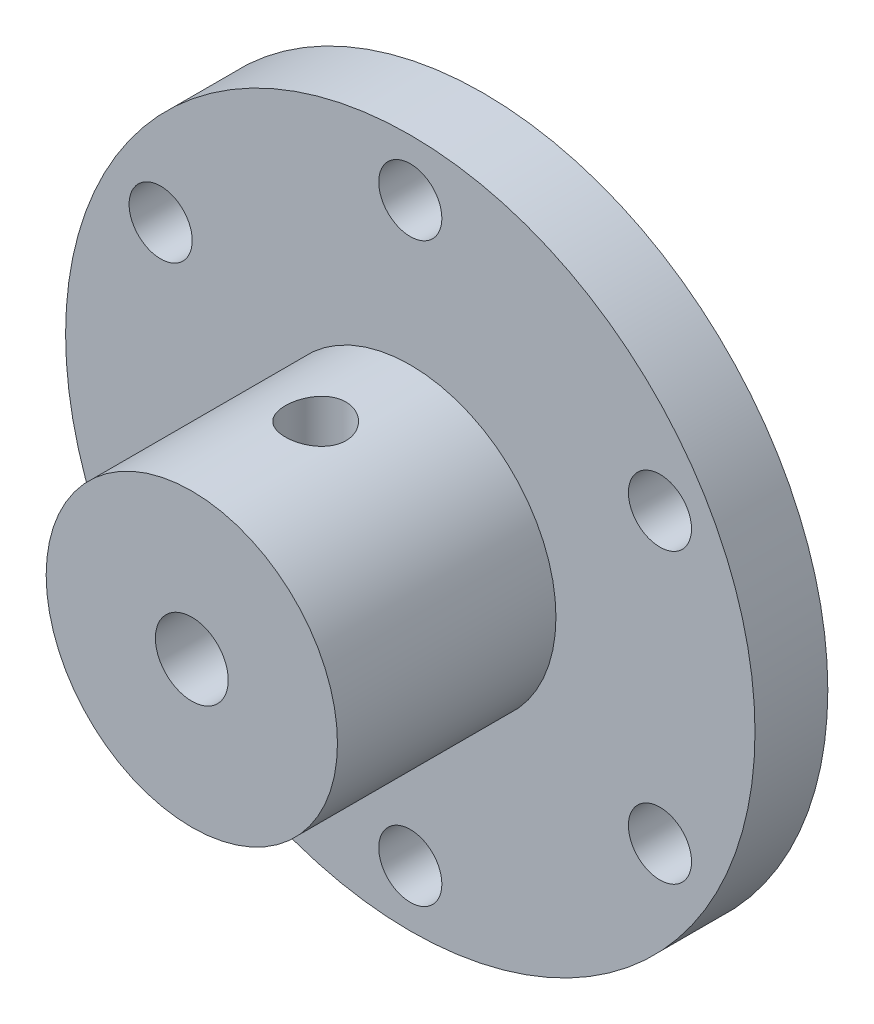
ISO-10303-21;
HEADER;
FILE_DESCRIPTION(('STEP AP214'),'2;1');
FILE_NAME('part.step','',(''),(''),'','','');
FILE_SCHEMA(('AUTOMOTIVE_DESIGN { 1 0 10303 214 1 1 1 1 }'));
ENDSEC;
DATA;
#1=APPLICATION_CONTEXT('core data for automotive mechanical design processes');
#2=APPLICATION_PROTOCOL_DEFINITION('international standard','automotive_design',2000,#1);
#3=PRODUCT_CONTEXT('',#1,'mechanical');
#4=PRODUCT('Part','Part','',(#3));
#5=PRODUCT_RELATED_PRODUCT_CATEGORY('part','',(#4));
#6=PRODUCT_DEFINITION_FORMATION('','',#4);
#7=PRODUCT_DEFINITION_CONTEXT('part definition',#1,'design');
#8=PRODUCT_DEFINITION('design','',#6,#7);
#9=PRODUCT_DEFINITION_SHAPE('','',#8);
#10=(LENGTH_UNIT() NAMED_UNIT(*) SI_UNIT(.MILLI.,.METRE.));
#11=(NAMED_UNIT(*) PLANE_ANGLE_UNIT() SI_UNIT($,.RADIAN.));
#12=(NAMED_UNIT(*) SI_UNIT($,.STERADIAN.) SOLID_ANGLE_UNIT());
#13=UNCERTAINTY_MEASURE_WITH_UNIT(LENGTH_MEASURE(1.E-05),#10,'distance_accuracy_value','');
#14=(GEOMETRIC_REPRESENTATION_CONTEXT(3) GLOBAL_UNCERTAINTY_ASSIGNED_CONTEXT((#13)) GLOBAL_UNIT_ASSIGNED_CONTEXT((#10,
#11,#12)) REPRESENTATION_CONTEXT('',''));
#15=CARTESIAN_POINT('',(0.,0.,0.));
#16=DIRECTION('',(0.,0.,1.));
#17=DIRECTION('',(1.,0.,0.));
#18=AXIS2_PLACEMENT_3D('',#15,#16,#17);
#19=CARTESIAN_POINT('',(0.,0.,24.));
#20=DIRECTION('',(0.,0.,-1.));
#21=DIRECTION('',(-1.,0.,0.));
#22=AXIS2_PLACEMENT_3D('',#19,#20,#21);
#23=CYLINDRICAL_SURFACE('',#22,12.);
#24=CARTESIAN_POINT('',(0.,0.,24.));
#25=DIRECTION('',(0.,0.,-1.));
#26=DIRECTION('',(-1.,0.,0.));
#27=AXIS2_PLACEMENT_3D('',#24,#25,#26);
#28=CIRCLE('',#27,12.);
#29=CARTESIAN_POINT('',(-12.,0.,24.));
#30=VERTEX_POINT('',#29);
#31=EDGE_CURVE('E54',#30,#30,#28,.T.);
#32=ORIENTED_EDGE('',*,*,#31,.T.);
#33=EDGE_LOOP('',(#32));
#34=FACE_BOUND('',#33,.T.);
#35=CARTESIAN_POINT('',(0.,0.,6.));
#36=DIRECTION('',(0.,0.,1.));
#37=DIRECTION('',(1.,0.,0.));
#38=AXIS2_PLACEMENT_3D('',#35,#36,#37);
#39=CIRCLE('',#38,12.);
#40=CARTESIAN_POINT('',(12.,0.,6.));
#41=VERTEX_POINT('',#40);
#42=EDGE_CURVE('E10',#41,#41,#39,.T.);
#43=ORIENTED_EDGE('',*,*,#42,.T.);
#44=EDGE_LOOP('',(#43));
#45=FACE_BOUND('',#44,.T.);
#46=CARTESIAN_POINT('',(0.,12.,11.3));
#47=CARTESIAN_POINT('',(-0.138818083403321,11.999997430533,11.3000049549384));
#48=CARTESIAN_POINT('',(-0.277697579041751,11.9975665755009,11.3116013314375));
#49=CARTESIAN_POINT('',(-0.551522632533987,11.9881040198136,11.3576386990657));
#50=CARTESIAN_POINT('',(-0.686465120256625,11.981068823785,11.3920970460739));
#51=CARTESIAN_POINT('',(-0.948418264582684,11.963182183924,11.4827409098436));
#52=CARTESIAN_POINT('',(-1.07543667341837,11.9523345410529,11.5389047919978));
#53=CARTESIAN_POINT('',(-1.31824065721192,11.9279985561972,11.6712992177124));
#54=CARTESIAN_POINT('',(-1.43402673506865,11.9145103325195,11.7475288623117));
#55=CARTESIAN_POINT('',(-1.65278064861767,11.886154000493,11.9190726803813));
#56=CARTESIAN_POINT('',(-1.75556048832537,11.8712701169706,12.0146240024702));
#57=CARTESIAN_POINT('',(-1.94375555353879,11.841913153849,12.2215893183902));
#58=CARTESIAN_POINT('',(-2.02916934192198,11.8274401083337,12.3330046237445));
#59=CARTESIAN_POINT('',(-2.18102063354434,11.8003888519062,12.5699039375323));
#60=CARTESIAN_POINT('',(-2.24726109361302,11.7878309034966,12.6955167690055));
#61=CARTESIAN_POINT('',(-2.35762238696128,11.7662568130004,12.9563949035455));
#62=CARTESIAN_POINT('',(-2.40174560335283,11.7572402893514,13.0916591648851));
#63=CARTESIAN_POINT('',(-2.46600480267474,11.7439300197224,13.3659704748313));
#64=CARTESIAN_POINT('',(-2.48647195393598,11.7395711371173,13.5049367186695));
#65=CARTESIAN_POINT('',(-2.50386715311229,11.7358738143298,13.7843936857253));
#66=CARTESIAN_POINT('',(-2.50079781789374,11.7365348160196,13.9248842377306));
#67=CARTESIAN_POINT('',(-2.47147438074394,11.7427434863835,14.2009620559504));
#68=CARTESIAN_POINT('',(-2.44560210465441,11.748210673598,14.3365919593224));
#69=CARTESIAN_POINT('',(-2.3720108705989,11.7632887523188,14.6015430192899));
#70=CARTESIAN_POINT('',(-2.32429078962764,11.7728998568263,14.7308638512127));
#71=CARTESIAN_POINT('',(-2.20800006427857,11.795263829282,14.980614456832));
#72=CARTESIAN_POINT('',(-2.13928005068474,11.8080390757117,15.1009725930541));
#73=CARTESIAN_POINT('',(-1.98304539854964,11.8352778002144,15.3285914885363));
#74=CARTESIAN_POINT('',(-1.89552842452518,11.8497414879707,15.435850617672));
#75=CARTESIAN_POINT('',(-1.70214984309357,11.8790746185982,15.6364279221607));
#76=CARTESIAN_POINT('',(-1.59596286682417,11.8939464639895,15.729432337794));
#77=CARTESIAN_POINT('',(-1.3693345772236,11.92216176286,15.896360884458));
#78=CARTESIAN_POINT('',(-1.24889305005153,11.9355051934047,15.9702847291968));
#79=CARTESIAN_POINT('',(-0.996811082470958,11.9591974188563,16.0970201630719));
#80=CARTESIAN_POINT('',(-0.865150923853,11.9695407942052,16.1497936091342));
#81=CARTESIAN_POINT('',(-0.59456924194431,11.9860267642256,16.232383409671));
#82=CARTESIAN_POINT('',(-0.455648677190178,11.9921699119211,16.2622027864628));
#83=CARTESIAN_POINT('',(-0.17718373140167,11.9994855043091,16.2975885041358));
#84=CARTESIAN_POINT('',(-0.0376961110523568,12.0007458707516,16.3035838829885));
#85=CARTESIAN_POINT('',(0.240287597515429,11.9983990450555,16.2923101000618));
#86=CARTESIAN_POINT('',(0.378783745924516,11.9947921509631,16.2750423627968));
#87=CARTESIAN_POINT('',(0.649452734239626,11.9831712995837,16.2180886930609));
#88=CARTESIAN_POINT('',(0.781674385788412,11.9752010573615,16.1786250292331));
#89=CARTESIAN_POINT('',(1.03762289332266,11.9557445448479,16.0786442791572));
#90=CARTESIAN_POINT('',(1.16134907267355,11.9442579948916,16.018125518268));
#91=CARTESIAN_POINT('',(1.39858861388699,11.9188248298143,15.8768392435249));
#92=CARTESIAN_POINT('',(1.51194643893967,11.9048478762466,15.7958161408619));
#93=CARTESIAN_POINT('',(1.72361089177304,11.8760513659942,15.6161608738475));
#94=CARTESIAN_POINT('',(1.82191575582657,11.8612317108502,15.5175266489621));
#95=CARTESIAN_POINT('',(2.0023572973036,11.8321204906275,15.3034888460006));
#96=CARTESIAN_POINT('',(2.08419829200409,11.81784178615,15.1878339360894));
#97=CARTESIAN_POINT('',(2.22729438158487,11.7917120203161,14.9441674315724));
#98=CARTESIAN_POINT('',(2.28855033355728,11.779860857893,14.8161563517218));
#99=CARTESIAN_POINT('',(2.38834492887844,11.7600340141608,14.5520776074035));
#100=CARTESIAN_POINT('',(2.42700619656063,11.7520374556937,14.4160579256683));
#101=CARTESIAN_POINT('',(2.48088077046815,11.7407836941939,14.1392668990155));
#102=CARTESIAN_POINT('',(2.49609743088882,11.7375258132073,13.9984962367611));
#103=CARTESIAN_POINT('',(2.50251852975223,11.7361581461701,13.7191731980007));
#104=CARTESIAN_POINT('',(2.49419085245451,11.73794804643,13.5806318595559));
#105=CARTESIAN_POINT('',(2.45479810628063,11.7462489450985,13.3069719821596));
#106=CARTESIAN_POINT('',(2.42373325564532,11.7527598981925,13.1718534103678));
#107=CARTESIAN_POINT('',(2.3399643553717,11.7697226489543,12.9092044562187));
#108=CARTESIAN_POINT('',(2.28732235136843,11.7801631401586,12.7816535070261));
#109=CARTESIAN_POINT('',(2.16194914599515,11.8038141147748,12.5371224479467));
#110=CARTESIAN_POINT('',(2.0892160796606,11.8170248553092,12.4201433207338));
#111=CARTESIAN_POINT('',(1.92414739068482,11.8450315910229,12.1977567458411));
#112=CARTESIAN_POINT('',(1.83147578083645,11.8598522773681,12.09260175087));
#113=CARTESIAN_POINT('',(1.62984887623067,11.8892367916643,11.8991810135473));
#114=CARTESIAN_POINT('',(1.52088983766594,11.9038005596976,11.810919164897));
#115=CARTESIAN_POINT('',(1.28826885501541,11.9312288909528,11.6528228536319));
#116=CARTESIAN_POINT('',(1.1644518430427,11.9440719214649,11.5832126402274));
#117=CARTESIAN_POINT('',(0.906639687996908,11.9663981698818,11.46589954314));
#118=CARTESIAN_POINT('',(0.772653563814488,11.975884323642,11.4181775056362));
#119=CARTESIAN_POINT('',(0.53203058580021,11.9886499956289,11.3549194434231));
#120=CARTESIAN_POINT('',(0.426735187455858,11.9928807132279,11.3343624735823));
#121=CARTESIAN_POINT('',(0.214305348353073,11.9985566557952,11.3069010914453));
#122=CARTESIAN_POINT('',(0.107170975697743,12.0000019836917,11.2999961746656));
#123=CARTESIAN_POINT('',(0.,12.,11.3));
#124=B_SPLINE_CURVE_WITH_KNOTS('',3,(#46,#47,#48,#49,#50,#51,#52,#53,#54,#55,#56,#57,#58,#59,
#60,#61,#62,#63,#64,#65,#66,#67,#68,#69,#70,#71,#72,#73,#74,#75,#76,#77,#78,#79,#80,#81,#82,#83,
#84,#85,#86,#87,#88,#89,#90,#91,#92,#93,#94,#95,#96,#97,#98,#99,#100,#101,#102,#103,#104,#105,
#106,#107,#108,#109,#110,#111,#112,#113,#114,#115,#116,#117,#118,#119,#120,#121,#122,#123),
.UNSPECIFIED.,.T.,.F.,(4,2,2,2,2,2,2,2,2,2,2,2,2,2,2,2,2,2,2,2,2,2,2,2,2,2,2,2,2,2,2,2,2,2,2,2,
2,2,4),(0.,0.416062090206367,0.832440399812451,1.24840475765089,1.66435048314598,
2.08575052776245,2.50718543103572,2.93280898357097,3.35838666570981,3.77793150339709,
4.19742969534329,4.61003424258119,5.0226600006056,5.43829184833498,5.85397536736069,
6.27779052710932,6.70161204556436,7.12619448999325,7.55072102091543,7.96756678815351,
8.38438703104555,8.79710573265243,9.20985726781867,9.62803167991474,10.0462550512915,
10.4714252765867,10.8965777970262,11.3194010019005,11.7421637082837,12.1565844658208,
12.5710012456272,12.9842346278651,13.3975063816296,13.8183804966062,14.2393515023474,
14.6651772879651,15.0906297292995,15.4118517695456,15.7330619394678),.UNSPECIFIED.);
#125=CARTESIAN_POINT('',(0.,12.,11.3));
#126=VERTEX_POINT('',#125);
#127=EDGE_CURVE('E129',#126,#126,#124,.T.);
#128=ORIENTED_EDGE('',*,*,#127,.F.);
#129=EDGE_LOOP('',(#128));
#130=FACE_BOUND('',#129,.T.);
#131=ADVANCED_FACE('F32',(#34,#45,#130),#23,.T.);
#132=CARTESIAN_POINT('',(0.,0.,32.4852813742386));
#133=DIRECTION('',(0.,0.,-1.));
#134=DIRECTION('',(-1.,0.,0.));
#135=AXIS2_PLACEMENT_3D('',#132,#133,#134);
#136=CYLINDRICAL_SURFACE('',#135,3.);
#137=CARTESIAN_POINT('',(0.,0.,0.));
#138=DIRECTION('',(0.,0.,1.));
#139=DIRECTION('',(1.,0.,0.));
#140=AXIS2_PLACEMENT_3D('',#137,#138,#139);
#141=CIRCLE('',#140,3.);
#142=CARTESIAN_POINT('',(3.,0.,0.));
#143=VERTEX_POINT('',#142);
#144=EDGE_CURVE('E135',#143,#143,#141,.T.);
#145=ORIENTED_EDGE('',*,*,#144,.F.);
#146=EDGE_LOOP('',(#145));
#147=FACE_BOUND('',#146,.T.);
#148=CARTESIAN_POINT('',(0.,0.,24.));
#149=DIRECTION('',(0.,0.,-1.));
#150=DIRECTION('',(-1.,0.,0.));
#151=AXIS2_PLACEMENT_3D('',#148,#149,#150);
#152=CIRCLE('',#151,3.);
#153=CARTESIAN_POINT('',(-3.,0.,24.));
#154=VERTEX_POINT('',#153);
#155=EDGE_CURVE('E136',#154,#154,#152,.T.);
#156=ORIENTED_EDGE('',*,*,#155,.F.);
#157=EDGE_LOOP('',(#156));
#158=FACE_BOUND('',#157,.T.);
#159=CARTESIAN_POINT('',(0.,3.,11.3));
#160=CARTESIAN_POINT('',(-0.118757533193203,2.99999522795205,11.3000048855537));
#161=CARTESIAN_POINT('',(-0.237551281104128,2.99288670594742,11.3085225039046));
#162=CARTESIAN_POINT('',(-0.471182492492811,2.96510762868268,11.3419627233518));
#163=CARTESIAN_POINT('',(-0.586016959612417,2.94442702942007,11.3668974739753));
#164=CARTESIAN_POINT('',(-0.807829942407297,2.89142690238865,11.4313121173327));
#165=CARTESIAN_POINT('',(-0.914850920904901,2.8591769655007,11.4707050743537));
#166=CARTESIAN_POINT('',(-1.11984139043408,2.78529176182903,11.5620170479426));
#167=CARTESIAN_POINT('',(-1.21780780775233,2.74365332434937,11.6139402966732));
#168=CARTESIAN_POINT('',(-1.43789998519767,2.63674191529867,11.7494537498082));
#169=CARTESIAN_POINT('',(-1.5556821965722,2.56840549256191,11.8376702041822));
#170=CARTESIAN_POINT('',(-1.77202398328147,2.42422624777674,12.0305243257514));
#171=CARTESIAN_POINT('',(-1.87052845158605,2.34836281453276,12.1352075692431));
#172=CARTESIAN_POINT('',(-2.00437263805588,2.23294886313738,12.3040842764911));
#173=CARTESIAN_POINT('',(-2.04699726278816,2.19383679994997,12.3629555761913));
#174=CARTESIAN_POINT('',(-2.12715295529554,2.11620611809194,12.4845056029605));
#175=CARTESIAN_POINT('',(-2.16468231743739,2.07768770195023,12.5471855948707));
#176=CARTESIAN_POINT('',(-2.23441122570746,2.00250543288661,12.6762673243356));
#177=CARTESIAN_POINT('',(-2.26662332666226,1.96583735754651,12.7426597847248));
#178=CARTESIAN_POINT('',(-2.32553690612792,1.89577686630311,12.8794462839284));
#179=CARTESIAN_POINT('',(-2.3522430799868,1.86238167220904,12.9498368473418));
#180=CARTESIAN_POINT('',(-2.40193513934005,1.79791918980412,13.1016670902001));
#181=CARTESIAN_POINT('',(-2.42433807692598,1.76736311251003,13.1835240927235));
#182=CARTESIAN_POINT('',(-2.46101313675502,1.71593180556003,13.3518897688131));
#183=CARTESIAN_POINT('',(-2.47530499393792,1.69503310194197,13.4383865866147));
#184=CARTESIAN_POINT('',(-2.49481072799048,1.66620928968844,13.6157654083795));
#185=CARTESIAN_POINT('',(-2.49991205058667,1.65844510563093,13.7066879590707));
#186=CARTESIAN_POINT('',(-2.5000856937119,1.65818308531825,13.8885626130028));
#187=CARTESIAN_POINT('',(-2.49515788278405,1.6656854491694,13.9795147166153));
#188=CARTESIAN_POINT('',(-2.47505262029594,1.69541639464497,14.1655247108271));
#189=CARTESIAN_POINT('',(-2.45905577113332,1.71881932066467,14.2602937457171));
#190=CARTESIAN_POINT('',(-2.41742550503027,1.77688235738914,14.4442109812022));
#191=CARTESIAN_POINT('',(-2.3917601104429,1.81157977103025,14.5333393707148));
#192=CARTESIAN_POINT('',(-2.33816270346873,1.88002226126137,14.6878270785411));
#193=CARTESIAN_POINT('',(-2.31177513033566,1.91250316845439,14.7543122424116));
#194=CARTESIAN_POINT('',(-2.25404424958636,1.98021996661529,14.8836508067799));
#195=CARTESIAN_POINT('',(-2.22269803586306,2.01545746697785,14.9465020478658));
#196=CARTESIAN_POINT('',(-2.12149677560466,2.12342648109725,15.1299668410197));
#197=CARTESIAN_POINT('',(-2.04450664231777,2.19837696967438,15.2454141476061));
#198=CARTESIAN_POINT('',(-1.86765914501414,2.35079897952278,15.4682669624543));
#199=CARTESIAN_POINT('',(-1.76681805277628,2.42819792618944,15.5749383239919));
#200=CARTESIAN_POINT('',(-1.54484388336149,2.57509054043285,15.7711123448174));
#201=CARTESIAN_POINT('',(-1.42375565615773,2.64460112267364,15.8606520330563));
#202=CARTESIAN_POINT('',(-1.19411179169416,2.75428914126547,15.9994148390986));
#203=CARTESIAN_POINT('',(-1.08972732107277,2.79748350073995,16.0531428981877));
#204=CARTESIAN_POINT('',(-0.87107145833037,2.87307804019801,16.1463427452553));
#205=CARTESIAN_POINT('',(-0.756806292780766,2.90548495660805,16.1858234315806));
#206=CARTESIAN_POINT('',(-0.519954301215422,2.95709834265565,16.2484172499322));
#207=CARTESIAN_POINT('',(-0.397310923125312,2.97620280955844,16.2714039466576));
#208=CARTESIAN_POINT('',(-0.148559976923731,2.99891434528972,16.2987092319272));
#209=CARTESIAN_POINT('',(-0.0224547835240055,3.00253178304177,16.3030403108502));
#210=CARTESIAN_POINT('',(0.213310199456572,2.99444999039147,16.2933375605562));
#211=CARTESIAN_POINT('',(0.323130540835856,2.98453350716313,16.2814413612848));
#212=CARTESIAN_POINT('',(0.538644964400602,2.95325589460135,16.2437330497885));
#213=CARTESIAN_POINT('',(0.644338549989559,2.93189339242796,16.217919268281));
#214=CARTESIAN_POINT('',(0.850565499199254,2.87889521546186,16.1533766045447));
#215=CARTESIAN_POINT('',(0.951010682223313,2.84712564891974,16.1144792105557));
#216=CARTESIAN_POINT('',(1.14365900898103,2.7753612473389,16.0256043676633));
#217=CARTESIAN_POINT('',(1.2358590883121,2.73536337221808,15.9756228230067));
#218=CARTESIAN_POINT('',(1.45067439735099,2.62975152158594,15.841568204653));
#219=CARTESIAN_POINT('',(1.56834359540731,2.56070244234714,15.7522674167327));
#220=CARTESIAN_POINT('',(1.78428994740848,2.41522445403191,15.5571596173444));
#221=CARTESIAN_POINT('',(1.88250490855173,2.33877300422835,15.4513015446453));
#222=CARTESIAN_POINT('',(2.01573314784291,2.22269805598601,15.2805880320714));
#223=CARTESIAN_POINT('',(2.05811069143949,2.1834115173603,15.221101727024));
#224=CARTESIAN_POINT('',(2.13771669597406,2.10553153817181,15.0982791839677));
#225=CARTESIAN_POINT('',(2.17494330406755,2.06693835133607,15.0349415723359));
#226=CARTESIAN_POINT('',(2.24398857026757,1.9917610848264,14.9045115960848));
#227=CARTESIAN_POINT('',(2.27582148781537,1.95517188634212,14.8374297754664));
#228=CARTESIAN_POINT('',(2.3338885673946,1.88547561448179,14.6992098955002));
#229=CARTESIAN_POINT('',(2.36012785984655,1.8523653645079,14.6280756295806));
#230=CARTESIAN_POINT('',(2.40837357148322,1.78925557416047,14.4757296316481));
#231=CARTESIAN_POINT('',(2.42988314318544,1.75970711786654,14.3941655489263));
#232=CARTESIAN_POINT('',(2.46482255689514,1.71043063887427,14.2265480460574));
#233=CARTESIAN_POINT('',(2.47827257713357,1.69067811225259,14.1405064286721));
#234=CARTESIAN_POINT('',(2.49617289535263,1.6641531597946,13.9643623925877));
#235=CARTESIAN_POINT('',(2.5005179918396,1.65753251048391,13.8742246702493));
#236=CARTESIAN_POINT('',(2.49938197104456,1.65924308630667,13.6941467872161));
#237=CARTESIAN_POINT('',(2.49389826274012,1.66757825402155,13.6042066848749));
#238=CARTESIAN_POINT('',(2.47265263848541,1.69892898735519,13.4183274246095));
#239=CARTESIAN_POINT('',(2.45585812550761,1.72341371023858,13.3227697294673));
#240=CARTESIAN_POINT('',(2.41250339675091,1.78358728037387,13.1374687039173));
#241=CARTESIAN_POINT('',(2.38591088285909,1.81931312531326,13.0477457712907));
#242=CARTESIAN_POINT('',(2.33050835844919,1.88952619366194,12.8922109586452));
#243=CARTESIAN_POINT('',(2.30325853049531,1.92277816627791,12.8252562407651));
#244=CARTESIAN_POINT('',(2.24370627018012,1.9919518523057,12.6950536135756));
#245=CARTESIAN_POINT('',(2.21140090020864,2.02787511150519,12.6318078890002));
#246=CARTESIAN_POINT('',(2.10716294428985,2.13775931167912,12.447270438658));
#247=CARTESIAN_POINT('',(2.02793576743751,2.2137978016432,12.3312530750081));
#248=CARTESIAN_POINT('',(1.84629697567414,2.36772603763546,12.1079927387088));
#249=CARTESIAN_POINT('',(1.74293959593281,2.44552394429512,12.0014582059671));
#250=CARTESIAN_POINT('',(1.51553554935621,2.59256498427754,11.8061362004607));
#251=CARTESIAN_POINT('',(1.39153583663216,2.66182692543068,11.7173094341261));
#252=CARTESIAN_POINT('',(1.15855518141084,2.76942305781508,11.5816858032769));
#253=CARTESIAN_POINT('',(1.05399877947694,2.81112174006882,11.5299614897806));
#254=CARTESIAN_POINT('',(0.835439786054363,2.88361460666452,11.4407813297614));
#255=CARTESIAN_POINT('',(0.721450026753909,2.9144233132377,11.4033064759047));
#256=CARTESIAN_POINT('',(0.506620038886861,2.9585874590469,11.3498115441734));
#257=CARTESIAN_POINT('',(0.406845468761925,2.97402142398111,11.3312248777732));
#258=CARTESIAN_POINT('',(0.204722725654237,2.99472922794408,11.3063176317619));
#259=CARTESIAN_POINT('',(0.102374818922784,3.00000411373941,11.2999957884131));
#260=CARTESIAN_POINT('',(0.,3.,11.3));
#261=B_SPLINE_CURVE_WITH_KNOTS('',3,(#159,#160,#161,#162,#163,#164,#165,#166,#167,#168,#169,
#170,#171,#172,#173,#174,#175,#176,#177,#178,#179,#180,#181,#182,#183,#184,#185,#186,#187,#188,
#189,#190,#191,#192,#193,#194,#195,#196,#197,#198,#199,#200,#201,#202,#203,#204,#205,#206,#207,
#208,#209,#210,#211,#212,#213,#214,#215,#216,#217,#218,#219,#220,#221,#222,#223,#224,#225,#226,
#227,#228,#229,#230,#231,#232,#233,#234,#235,#236,#237,#238,#239,#240,#241,#242,#243,#244,#245,
#246,#247,#248,#249,#250,#251,#252,#253,#254,#255,#256,#257,#258,#259,#260),.UNSPECIFIED.,.T.,
.F.,(4,2,2,2,2,2,2,2,2,2,2,2,2,2,2,2,2,2,2,2,2,2,2,2,2,2,2,2,2,2,2,2,2,2,2,2,2,2,2,2,2,2,2,2,2,
2,2,2,2,2,4),(0.,0.355841276815113,0.711946191026961,1.06594405359551,1.42006164830116,
1.90425178760126,2.38980643116775,2.63722280423449,2.88472179650724,3.13162777943676,
3.37832232674674,3.64812890035755,3.91727616616869,4.18969776924975,4.46212294312047,
4.75723524199722,5.05333228584568,5.28870178855694,5.52420974868633,5.9954933935898,
6.49137310548271,6.98616858956867,7.36002155957575,7.73364063000476,8.11009395319721,
8.48629519274361,8.81743460677926,9.14861374669872,9.48423297747606,9.81997643164433,
10.3065635514456,10.7946819775667,11.0432812121088,11.2919696391639,11.5399899810636,
11.787781852862,12.0551105531685,12.3217671309317,12.5914881373799,12.8612802568452,
13.1598101383752,13.4593330283462,13.6977271411687,13.9362602949129,14.4135864576438,
14.914300110886,15.413889999571,15.7841228897598,16.1538601797496,16.4606444271243,
16.7673970625124),.UNSPECIFIED.);
#262=CARTESIAN_POINT('',(0.,3.,11.3));
#263=VERTEX_POINT('',#262);
#264=EDGE_CURVE('E36',#263,#263,#261,.T.);
#265=ORIENTED_EDGE('',*,*,#264,.T.);
#266=EDGE_LOOP('',(#265));
#267=FACE_BOUND('',#266,.T.);
#268=ADVANCED_FACE('F115',(#147,#158,#267),#136,.F.);
#269=CARTESIAN_POINT('',(0.,23.75,6.));
#270=DIRECTION('',(0.,0.,-1.));
#271=DIRECTION('',(-1.,0.,0.));
#272=AXIS2_PLACEMENT_3D('',#269,#270,#271);
#273=CYLINDRICAL_SURFACE('',#272,2.6);
#274=CARTESIAN_POINT('',(0.,23.75,6.));
#275=DIRECTION('',(0.,0.,1.));
#276=DIRECTION('',(1.,0.,0.));
#277=AXIS2_PLACEMENT_3D('',#274,#275,#276);
#278=CIRCLE('',#277,2.6);
#279=CARTESIAN_POINT('',(2.6,23.75,6.));
#280=VERTEX_POINT('',#279);
#281=EDGE_CURVE('E50',#280,#280,#278,.T.);
#282=ORIENTED_EDGE('',*,*,#281,.T.);
#283=EDGE_LOOP('',(#282));
#284=FACE_BOUND('',#283,.T.);
#285=CARTESIAN_POINT('',(0.,23.75,0.));
#286=DIRECTION('',(0.,0.,1.));
#287=DIRECTION('',(1.,0.,0.));
#288=AXIS2_PLACEMENT_3D('',#285,#286,#287);
#289=CIRCLE('',#288,2.6);
#290=CARTESIAN_POINT('',(2.6,23.75,0.));
#291=VERTEX_POINT('',#290);
#292=EDGE_CURVE('E89',#291,#291,#289,.T.);
#293=ORIENTED_EDGE('',*,*,#292,.F.);
#294=EDGE_LOOP('',(#293));
#295=FACE_BOUND('',#294,.T.);
#296=ADVANCED_FACE('F121',(#284,#295),#273,.F.);
#297=CARTESIAN_POINT('',(20.5681033398809,11.8750000000009,6.));
#298=DIRECTION('',(0.,0.,-1.));
#299=DIRECTION('',(-1.,0.,0.));
#300=AXIS2_PLACEMENT_3D('',#297,#298,#299);
#301=CYLINDRICAL_SURFACE('',#300,2.60000000000028);
#302=CARTESIAN_POINT('',(20.5681033398809,11.8750000000009,6.));
#303=DIRECTION('',(0.,0.,1.));
#304=DIRECTION('',(1.,0.,0.));
#305=AXIS2_PLACEMENT_3D('',#302,#303,#304);
#306=CIRCLE('',#305,2.60000000000028);
#307=CARTESIAN_POINT('',(23.1681033398812,11.8750000000009,6.));
#308=VERTEX_POINT('',#307);
#309=EDGE_CURVE('E69',#308,#308,#306,.T.);
#310=ORIENTED_EDGE('',*,*,#309,.T.);
#311=EDGE_LOOP('',(#310));
#312=FACE_BOUND('',#311,.T.);
#313=CARTESIAN_POINT('',(20.5681033398809,11.8750000000009,0.));
#314=DIRECTION('',(0.,0.,1.));
#315=DIRECTION('',(1.,0.,0.));
#316=AXIS2_PLACEMENT_3D('',#313,#314,#315);
#317=CIRCLE('',#316,2.60000000000028);
#318=CARTESIAN_POINT('',(23.1681033398812,11.8750000000009,0.));
#319=VERTEX_POINT('',#318);
#320=EDGE_CURVE('E86',#319,#319,#317,.T.);
#321=ORIENTED_EDGE('',*,*,#320,.F.);
#322=EDGE_LOOP('',(#321));
#323=FACE_BOUND('',#322,.T.);
#324=ADVANCED_FACE('F177',(#312,#323),#301,.F.);
#325=CARTESIAN_POINT('',(20.5681033398819,-11.8749999999991,6.));
#326=DIRECTION('',(0.,0.,-1.));
#327=DIRECTION('',(-1.,0.,0.));
#328=AXIS2_PLACEMENT_3D('',#325,#326,#327);
#329=CYLINDRICAL_SURFACE('',#328,2.6000000000013);
#330=CARTESIAN_POINT('',(20.5681033398819,-11.8749999999991,6.));
#331=DIRECTION('',(0.,0.,1.));
#332=DIRECTION('',(1.,0.,0.));
#333=AXIS2_PLACEMENT_3D('',#330,#331,#332);
#334=CIRCLE('',#333,2.6000000000013);
#335=CARTESIAN_POINT('',(23.1681033398832,-11.8749999999991,6.));
#336=VERTEX_POINT('',#335);
#337=EDGE_CURVE('E66',#336,#336,#334,.T.);
#338=ORIENTED_EDGE('',*,*,#337,.T.);
#339=EDGE_LOOP('',(#338));
#340=FACE_BOUND('',#339,.T.);
#341=CARTESIAN_POINT('',(20.5681033398819,-11.8749999999991,0.));
#342=DIRECTION('',(0.,0.,1.));
#343=DIRECTION('',(1.,0.,0.));
#344=AXIS2_PLACEMENT_3D('',#341,#342,#343);
#345=CIRCLE('',#344,2.6000000000013);
#346=CARTESIAN_POINT('',(23.1681033398832,-11.8749999999991,0.));
#347=VERTEX_POINT('',#346);
#348=EDGE_CURVE('E83',#347,#347,#345,.T.);
#349=ORIENTED_EDGE('',*,*,#348,.F.);
#350=EDGE_LOOP('',(#349));
#351=FACE_BOUND('',#350,.T.);
#352=ADVANCED_FACE('F185',(#340,#351),#329,.F.);
#353=CARTESIAN_POINT('',(2.01922972462034E-12,-23.75,6.));
#354=DIRECTION('',(0.,0.,-1.));
#355=DIRECTION('',(-1.,0.,0.));
#356=AXIS2_PLACEMENT_3D('',#353,#354,#355);
#357=CYLINDRICAL_SURFACE('',#356,2.60000000000209);
#358=CARTESIAN_POINT('',(2.01922972462034E-12,-23.75,6.));
#359=DIRECTION('',(0.,0.,1.));
#360=DIRECTION('',(1.,0.,0.));
#361=AXIS2_PLACEMENT_3D('',#358,#359,#360);
#362=CIRCLE('',#361,2.60000000000209);
#363=CARTESIAN_POINT('',(2.60000000000411,-23.75,6.));
#364=VERTEX_POINT('',#363);
#365=EDGE_CURVE('E63',#364,#364,#362,.T.);
#366=ORIENTED_EDGE('',*,*,#365,.T.);
#367=EDGE_LOOP('',(#366));
#368=FACE_BOUND('',#367,.T.);
#369=CARTESIAN_POINT('',(2.01922972462034E-12,-23.75,0.));
#370=DIRECTION('',(0.,0.,1.));
#371=DIRECTION('',(1.,0.,0.));
#372=AXIS2_PLACEMENT_3D('',#369,#370,#371);
#373=CIRCLE('',#372,2.60000000000209);
#374=CARTESIAN_POINT('',(2.60000000000411,-23.75,0.));
#375=VERTEX_POINT('',#374);
#376=EDGE_CURVE('E80',#375,#375,#373,.T.);
#377=ORIENTED_EDGE('',*,*,#376,.F.);
#378=EDGE_LOOP('',(#377));
#379=FACE_BOUND('',#378,.T.);
#380=ADVANCED_FACE('F193',(#368,#379),#357,.F.);
#381=CARTESIAN_POINT('',(-20.5681033398789,-11.8750000000009,6.));
#382=DIRECTION('',(0.,0.,-1.));
#383=DIRECTION('',(-1.,0.,0.));
#384=AXIS2_PLACEMENT_3D('',#381,#382,#383);
#385=CYLINDRICAL_SURFACE('',#384,2.60000000000192);
#386=CARTESIAN_POINT('',(-20.5681033398789,-11.8750000000009,6.));
#387=DIRECTION('',(0.,0.,1.));
#388=DIRECTION('',(1.,0.,0.));
#389=AXIS2_PLACEMENT_3D('',#386,#387,#388);
#390=CIRCLE('',#389,2.60000000000192);
#391=CARTESIAN_POINT('',(-17.968103339877,-11.8750000000009,6.));
#392=VERTEX_POINT('',#391);
#393=EDGE_CURVE('E59',#392,#392,#390,.T.);
#394=ORIENTED_EDGE('',*,*,#393,.T.);
#395=EDGE_LOOP('',(#394));
#396=FACE_BOUND('',#395,.T.);
#397=CARTESIAN_POINT('',(-20.5681033398789,-11.8750000000009,0.));
#398=DIRECTION('',(0.,0.,1.));
#399=DIRECTION('',(1.,0.,0.));
#400=AXIS2_PLACEMENT_3D('',#397,#398,#399);
#401=CIRCLE('',#400,2.60000000000192);
#402=CARTESIAN_POINT('',(-17.968103339877,-11.8750000000009,0.));
#403=VERTEX_POINT('',#402);
#404=EDGE_CURVE('E77',#403,#403,#401,.T.);
#405=ORIENTED_EDGE('',*,*,#404,.F.);
#406=EDGE_LOOP('',(#405));
#407=FACE_BOUND('',#406,.T.);
#408=ADVANCED_FACE('F201',(#396,#407),#385,.F.);
#409=CARTESIAN_POINT('',(-20.5681033398799,11.8749999999991,6.));
#410=DIRECTION('',(0.,0.,-1.));
#411=DIRECTION('',(-1.,0.,0.));
#412=AXIS2_PLACEMENT_3D('',#409,#410,#411);
#413=CYLINDRICAL_SURFACE('',#412,2.60000000000102);
#414=CARTESIAN_POINT('',(-20.5681033398799,11.8749999999991,6.));
#415=DIRECTION('',(0.,0.,1.));
#416=DIRECTION('',(1.,0.,0.));
#417=AXIS2_PLACEMENT_3D('',#414,#415,#416);
#418=CIRCLE('',#417,2.60000000000102);
#419=CARTESIAN_POINT('',(-17.9681033398789,11.8749999999991,6.));
#420=VERTEX_POINT('',#419);
#421=EDGE_CURVE('E56',#420,#420,#418,.T.);
#422=ORIENTED_EDGE('',*,*,#421,.T.);
#423=EDGE_LOOP('',(#422));
#424=FACE_BOUND('',#423,.T.);
#425=CARTESIAN_POINT('',(-20.5681033398799,11.8749999999991,0.));
#426=DIRECTION('',(0.,0.,1.));
#427=DIRECTION('',(1.,0.,0.));
#428=AXIS2_PLACEMENT_3D('',#425,#426,#427);
#429=CIRCLE('',#428,2.60000000000102);
#430=CARTESIAN_POINT('',(-17.9681033398789,11.8749999999991,0.));
#431=VERTEX_POINT('',#430);
#432=EDGE_CURVE('E74',#431,#431,#429,.T.);
#433=ORIENTED_EDGE('',*,*,#432,.F.);
#434=EDGE_LOOP('',(#433));
#435=FACE_BOUND('',#434,.T.);
#436=ADVANCED_FACE('F34',(#424,#435),#413,.F.);
#437=CARTESIAN_POINT('',(0.,0.,6.));
#438=DIRECTION('',(0.,0.,-1.));
#439=DIRECTION('',(-1.,0.,0.));
#440=AXIS2_PLACEMENT_3D('',#437,#438,#439);
#441=CYLINDRICAL_SURFACE('',#440,28.4);
#442=CARTESIAN_POINT('',(0.,0.,6.));
#443=DIRECTION('',(0.,0.,1.));
#444=DIRECTION('',(1.,0.,0.));
#445=AXIS2_PLACEMENT_3D('',#442,#443,#444);
#446=CIRCLE('',#445,28.4);
#447=CARTESIAN_POINT('',(28.4,0.,6.));
#448=VERTEX_POINT('',#447);
#449=EDGE_CURVE('E45',#448,#448,#446,.T.);
#450=ORIENTED_EDGE('',*,*,#449,.F.);
#451=EDGE_LOOP('',(#450));
#452=FACE_BOUND('',#451,.T.);
#453=CARTESIAN_POINT('',(0.,0.,0.));
#454=DIRECTION('',(0.,0.,1.));
#455=DIRECTION('',(1.,0.,0.));
#456=AXIS2_PLACEMENT_3D('',#453,#454,#455);
#457=CIRCLE('',#456,28.4);
#458=CARTESIAN_POINT('',(28.4,0.,0.));
#459=VERTEX_POINT('',#458);
#460=EDGE_CURVE('E60',#459,#459,#457,.T.);
#461=ORIENTED_EDGE('',*,*,#460,.T.);
#462=EDGE_LOOP('',(#461));
#463=FACE_BOUND('',#462,.T.);
#464=ADVANCED_FACE('F94',(#452,#463),#441,.T.);
#465=CARTESIAN_POINT('',(0.,0.,6.));
#466=DIRECTION('',(0.,0.,1.));
#467=DIRECTION('',(1.,0.,0.));
#468=AXIS2_PLACEMENT_3D('',#465,#466,#467);
#469=PLANE('',#468);
#470=ORIENTED_EDGE('',*,*,#42,.F.);
#471=EDGE_LOOP('',(#470));
#472=FACE_BOUND('',#471,.T.);
#473=ORIENTED_EDGE('',*,*,#421,.F.);
#474=EDGE_LOOP('',(#473));
#475=FACE_BOUND('',#474,.T.);
#476=ORIENTED_EDGE('',*,*,#393,.F.);
#477=EDGE_LOOP('',(#476));
#478=FACE_BOUND('',#477,.T.);
#479=ORIENTED_EDGE('',*,*,#365,.F.);
#480=EDGE_LOOP('',(#479));
#481=FACE_BOUND('',#480,.T.);
#482=ORIENTED_EDGE('',*,*,#337,.F.);
#483=EDGE_LOOP('',(#482));
#484=FACE_BOUND('',#483,.T.);
#485=ORIENTED_EDGE('',*,*,#309,.F.);
#486=EDGE_LOOP('',(#485));
#487=FACE_BOUND('',#486,.T.);
#488=ORIENTED_EDGE('',*,*,#281,.F.);
#489=EDGE_LOOP('',(#488));
#490=FACE_BOUND('',#489,.T.);
#491=ORIENTED_EDGE('',*,*,#449,.T.);
#492=EDGE_LOOP('',(#491));
#493=FACE_BOUND('',#492,.T.);
#494=ADVANCED_FACE('F99',(#472,#475,#478,#481,#484,#487,#490,#493),#469,.T.);
#495=CARTESIAN_POINT('',(0.,0.,0.));
#496=DIRECTION('',(0.,0.,1.));
#497=DIRECTION('',(1.,0.,0.));
#498=AXIS2_PLACEMENT_3D('',#495,#496,#497);
#499=PLANE('',#498);
#500=ORIENTED_EDGE('',*,*,#144,.T.);
#501=EDGE_LOOP('',(#500));
#502=FACE_BOUND('',#501,.T.);
#503=ORIENTED_EDGE('',*,*,#432,.T.);
#504=EDGE_LOOP('',(#503));
#505=FACE_BOUND('',#504,.T.);
#506=ORIENTED_EDGE('',*,*,#404,.T.);
#507=EDGE_LOOP('',(#506));
#508=FACE_BOUND('',#507,.T.);
#509=ORIENTED_EDGE('',*,*,#376,.T.);
#510=EDGE_LOOP('',(#509));
#511=FACE_BOUND('',#510,.T.);
#512=ORIENTED_EDGE('',*,*,#348,.T.);
#513=EDGE_LOOP('',(#512));
#514=FACE_BOUND('',#513,.T.);
#515=ORIENTED_EDGE('',*,*,#320,.T.);
#516=EDGE_LOOP('',(#515));
#517=FACE_BOUND('',#516,.T.);
#518=ORIENTED_EDGE('',*,*,#292,.T.);
#519=EDGE_LOOP('',(#518));
#520=FACE_BOUND('',#519,.T.);
#521=ORIENTED_EDGE('',*,*,#460,.F.);
#522=EDGE_LOOP('',(#521));
#523=FACE_BOUND('',#522,.T.);
#524=ADVANCED_FACE('F96',(#502,#505,#508,#511,#514,#517,#520,#523),#499,.F.);
#525=CARTESIAN_POINT('',(0.,0.,24.));
#526=DIRECTION('',(0.,0.,-1.));
#527=DIRECTION('',(-1.,0.,0.));
#528=AXIS2_PLACEMENT_3D('',#525,#526,#527);
#529=PLANE('',#528);
#530=ORIENTED_EDGE('',*,*,#155,.T.);
#531=EDGE_LOOP('',(#530));
#532=FACE_BOUND('',#531,.T.);
#533=ORIENTED_EDGE('',*,*,#31,.F.);
#534=EDGE_LOOP('',(#533));
#535=FACE_BOUND('',#534,.T.);
#536=ADVANCED_FACE('F98',(#532,#535),#529,.F.);
#537=CARTESIAN_POINT('',(0.,28.401,13.8));
#538=DIRECTION('',(0.,-1.,0.));
#539=DIRECTION('',(0.,0.,-1.));
#540=AXIS2_PLACEMENT_3D('',#537,#538,#539);
#541=CYLINDRICAL_SURFACE('',#540,2.5);
#542=ORIENTED_EDGE('',*,*,#264,.F.);
#543=EDGE_LOOP('',(#542));
#544=FACE_BOUND('',#543,.T.);
#545=ORIENTED_EDGE('',*,*,#127,.T.);
#546=EDGE_LOOP('',(#545));
#547=FACE_BOUND('',#546,.T.);
#548=ADVANCED_FACE('F106',(#544,#547),#541,.F.);
#549=CLOSED_SHELL('',(#131,#268,#296,#324,#352,#380,#408,#436,#464,#494,#524,#536,#548));
#550=MANIFOLD_SOLID_BREP('B2',#549);
#551=ADVANCED_BREP_SHAPE_REPRESENTATION('',(#18,#550),#14);
#552=SHAPE_DEFINITION_REPRESENTATION(#9,#551);
ENDSEC;
END-ISO-10303-21;
